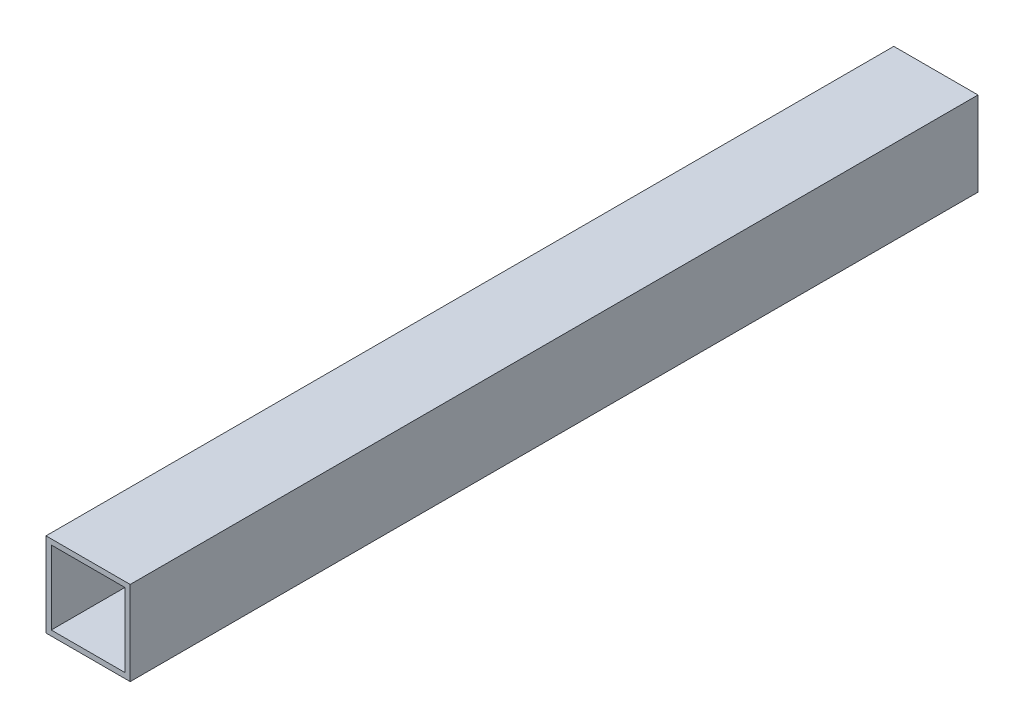
ISO-10303-21;
HEADER;
FILE_DESCRIPTION(('STEP AP214'),'2;1');
FILE_NAME('part.step','',(''),(''),'','','');
FILE_SCHEMA(('AUTOMOTIVE_DESIGN { 1 0 10303 214 1 1 1 1 }'));
ENDSEC;
DATA;
#1=APPLICATION_CONTEXT('core data for automotive mechanical design processes');
#2=APPLICATION_PROTOCOL_DEFINITION('international standard','automotive_design',2000,#1);
#3=PRODUCT_CONTEXT('',#1,'mechanical');
#4=PRODUCT('Part','Part','',(#3));
#5=PRODUCT_RELATED_PRODUCT_CATEGORY('part','',(#4));
#6=PRODUCT_DEFINITION_FORMATION('','',#4);
#7=PRODUCT_DEFINITION_CONTEXT('part definition',#1,'design');
#8=PRODUCT_DEFINITION('design','',#6,#7);
#9=PRODUCT_DEFINITION_SHAPE('','',#8);
#10=(LENGTH_UNIT() NAMED_UNIT(*) SI_UNIT(.MILLI.,.METRE.));
#11=(NAMED_UNIT(*) PLANE_ANGLE_UNIT() SI_UNIT($,.RADIAN.));
#12=(NAMED_UNIT(*) SI_UNIT($,.STERADIAN.) SOLID_ANGLE_UNIT());
#13=UNCERTAINTY_MEASURE_WITH_UNIT(LENGTH_MEASURE(1.E-05),#10,'distance_accuracy_value','');
#14=(GEOMETRIC_REPRESENTATION_CONTEXT(3) GLOBAL_UNCERTAINTY_ASSIGNED_CONTEXT((#13)) GLOBAL_UNIT_ASSIGNED_CONTEXT((#10,
#11,#12)) REPRESENTATION_CONTEXT('',''));
#15=CARTESIAN_POINT('',(0.,0.,0.));
#16=DIRECTION('',(0.,0.,1.));
#17=DIRECTION('',(1.,0.,0.));
#18=AXIS2_PLACEMENT_3D('',#15,#16,#17);
#19=CARTESIAN_POINT('',(-12.7,-28.5749999999999,-54.9710244842767));
#20=DIRECTION('',(0.,-1.,0.));
#21=DIRECTION('',(0.,0.,-1.));
#22=AXIS2_PLACEMENT_3D('',#19,#20,#21);
#23=PLANE('',#22);
#24=DIRECTION('',(-1.,0.,0.));
#25=VECTOR('',#24,1.);
#26=CARTESIAN_POINT('',(-12.7,-28.5749999999999,-19.0500000000001));
#27=LINE('',#26,#25);
#28=CARTESIAN_POINT('',(12.7,-28.5749999999999,-19.0500000000001));
#29=VERTEX_POINT('',#28);
#30=CARTESIAN_POINT('',(-12.7,-28.5749999999999,-19.0500000000001));
#31=VERTEX_POINT('',#30);
#32=EDGE_CURVE('E11',#29,#31,#27,.T.);
#33=ORIENTED_EDGE('',*,*,#32,.F.);
#34=DIRECTION('',(0.,0.,1.));
#35=VECTOR('',#34,1.);
#36=CARTESIAN_POINT('',(12.7,-28.5749999999999,-54.9710244842767));
#37=LINE('',#36,#35);
#38=CARTESIAN_POINT('',(12.7,-28.5749999999999,236.728000000002));
#39=VERTEX_POINT('',#38);
#40=EDGE_CURVE('E107',#29,#39,#37,.T.);
#41=ORIENTED_EDGE('',*,*,#40,.T.);
#42=DIRECTION('',(1.,0.,0.));
#43=VECTOR('',#42,1.);
#44=CARTESIAN_POINT('',(-12.7,-28.5749999999999,236.728000000002));
#45=LINE('',#44,#43);
#46=CARTESIAN_POINT('',(-12.7,-28.5749999999999,236.728000000002));
#47=VERTEX_POINT('',#46);
#48=EDGE_CURVE('E135',#47,#39,#45,.T.);
#49=ORIENTED_EDGE('',*,*,#48,.F.);
#50=DIRECTION('',(0.,0.,1.));
#51=VECTOR('',#50,1.);
#52=CARTESIAN_POINT('',(-12.7,-28.5749999999999,-54.9710244842767));
#53=LINE('',#52,#51);
#54=EDGE_CURVE('E109',#31,#47,#53,.T.);
#55=ORIENTED_EDGE('',*,*,#54,.F.);
#56=EDGE_LOOP('',(#33,#41,#49,#55));
#57=FACE_BOUND('',#56,.T.);
#58=ADVANCED_FACE('F31',(#57),#23,.T.);
#59=CARTESIAN_POINT('',(12.7,-3.17499999999989,-54.9710244842767));
#60=DIRECTION('',(1.,0.,0.));
#61=DIRECTION('',(0.,0.,-1.));
#62=AXIS2_PLACEMENT_3D('',#59,#60,#61);
#63=PLANE('',#62);
#64=DIRECTION('',(0.,-1.,0.));
#65=VECTOR('',#64,1.);
#66=CARTESIAN_POINT('',(12.7,-3.1749999999999,-19.0500000000001));
#67=LINE('',#66,#65);
#68=CARTESIAN_POINT('',(12.7,-3.17499999999989,-19.0500000000001));
#69=VERTEX_POINT('',#68);
#70=EDGE_CURVE('E76',#69,#29,#67,.T.);
#71=ORIENTED_EDGE('',*,*,#70,.F.);
#72=DIRECTION('',(0.,0.,1.));
#73=VECTOR('',#72,1.);
#74=CARTESIAN_POINT('',(12.7,-3.17499999999989,-54.9710244842767));
#75=LINE('',#74,#73);
#76=CARTESIAN_POINT('',(12.7,-3.17499999999989,236.728000000002));
#77=VERTEX_POINT('',#76);
#78=EDGE_CURVE('E104',#69,#77,#75,.T.);
#79=ORIENTED_EDGE('',*,*,#78,.T.);
#80=DIRECTION('',(0.,1.,0.));
#81=VECTOR('',#80,1.);
#82=CARTESIAN_POINT('',(12.7,-3.17499999999992,236.728000000002));
#83=LINE('',#82,#81);
#84=EDGE_CURVE('E138',#39,#77,#83,.T.);
#85=ORIENTED_EDGE('',*,*,#84,.F.);
#86=ORIENTED_EDGE('',*,*,#40,.F.);
#87=EDGE_LOOP('',(#71,#79,#85,#86));
#88=FACE_BOUND('',#87,.T.);
#89=ADVANCED_FACE('F171',(#88),#63,.T.);
#90=CARTESIAN_POINT('',(-12.7,-3.17499999999989,-54.9710244842767));
#91=DIRECTION('',(0.,1.,0.));
#92=DIRECTION('',(0.,0.,1.));
#93=AXIS2_PLACEMENT_3D('',#90,#91,#92);
#94=PLANE('',#93);
#95=DIRECTION('',(1.,0.,0.));
#96=VECTOR('',#95,1.);
#97=CARTESIAN_POINT('',(-12.7,-3.17499999999989,-19.0500000000001));
#98=LINE('',#97,#96);
#99=CARTESIAN_POINT('',(-12.7,-3.17499999999989,-19.0500000000001));
#100=VERTEX_POINT('',#99);
#101=EDGE_CURVE('E50',#100,#69,#98,.T.);
#102=ORIENTED_EDGE('',*,*,#101,.F.);
#103=DIRECTION('',(0.,0.,1.));
#104=VECTOR('',#103,1.);
#105=CARTESIAN_POINT('',(-12.7,-3.17499999999989,-54.9710244842767));
#106=LINE('',#105,#104);
#107=CARTESIAN_POINT('',(-12.7,-3.17499999999989,236.728000000002));
#108=VERTEX_POINT('',#107);
#109=EDGE_CURVE('E77',#100,#108,#106,.T.);
#110=ORIENTED_EDGE('',*,*,#109,.T.);
#111=DIRECTION('',(-1.,0.,0.));
#112=VECTOR('',#111,1.);
#113=CARTESIAN_POINT('',(-12.7,-3.17499999999989,236.728000000002));
#114=LINE('',#113,#112);
#115=EDGE_CURVE('E141',#77,#108,#114,.T.);
#116=ORIENTED_EDGE('',*,*,#115,.F.);
#117=ORIENTED_EDGE('',*,*,#78,.F.);
#118=EDGE_LOOP('',(#102,#110,#116,#117));
#119=FACE_BOUND('',#118,.T.);
#120=ADVANCED_FACE('F176',(#119),#94,.T.);
#121=CARTESIAN_POINT('',(-12.7,-3.17499999999989,-54.9710244842767));
#122=DIRECTION('',(-1.,0.,0.));
#123=DIRECTION('',(0.,0.,1.));
#124=AXIS2_PLACEMENT_3D('',#121,#122,#123);
#125=PLANE('',#124);
#126=DIRECTION('',(0.,1.,0.));
#127=VECTOR('',#126,1.);
#128=CARTESIAN_POINT('',(-12.7,-3.1749999999999,-19.0500000000001));
#129=LINE('',#128,#127);
#130=EDGE_CURVE('E124',#31,#100,#129,.T.);
#131=ORIENTED_EDGE('',*,*,#130,.F.);
#132=ORIENTED_EDGE('',*,*,#54,.T.);
#133=DIRECTION('',(0.,-1.,0.));
#134=VECTOR('',#133,1.);
#135=CARTESIAN_POINT('',(-12.7,-3.17499999999992,236.728000000002));
#136=LINE('',#135,#134);
#137=EDGE_CURVE('E132',#108,#47,#136,.T.);
#138=ORIENTED_EDGE('',*,*,#137,.F.);
#139=ORIENTED_EDGE('',*,*,#109,.F.);
#140=EDGE_LOOP('',(#131,#132,#138,#139));
#141=FACE_BOUND('',#140,.T.);
#142=ADVANCED_FACE('F33',(#141),#125,.T.);
#143=CARTESIAN_POINT('',(-11.1125,-26.9874999999999,-54.9710244842767));
#144=DIRECTION('',(0.,-1.,0.));
#145=DIRECTION('',(0.,0.,-1.));
#146=AXIS2_PLACEMENT_3D('',#143,#144,#145);
#147=PLANE('',#146);
#148=DIRECTION('',(0.,0.,1.));
#149=VECTOR('',#148,1.);
#150=CARTESIAN_POINT('',(11.1125,-26.9874999999999,-54.9710244842767));
#151=LINE('',#150,#149);
#152=CARTESIAN_POINT('',(11.1125,-26.9874999999999,-19.0500000000001));
#153=VERTEX_POINT('',#152);
#154=CARTESIAN_POINT('',(11.1125,-26.9874999999999,236.728000000002));
#155=VERTEX_POINT('',#154);
#156=EDGE_CURVE('E83',#153,#155,#151,.T.);
#157=ORIENTED_EDGE('',*,*,#156,.F.);
#158=DIRECTION('',(-1.,0.,0.));
#159=VECTOR('',#158,1.);
#160=CARTESIAN_POINT('',(-11.1125,-26.9874999999999,-19.0500000000001));
#161=LINE('',#160,#159);
#162=CARTESIAN_POINT('',(-11.1125,-26.9874999999999,-19.0500000000001));
#163=VERTEX_POINT('',#162);
#164=EDGE_CURVE('E35',#153,#163,#161,.T.);
#165=ORIENTED_EDGE('',*,*,#164,.T.);
#166=DIRECTION('',(0.,0.,1.));
#167=VECTOR('',#166,1.);
#168=CARTESIAN_POINT('',(-11.1125,-26.9874999999999,-54.9710244842767));
#169=LINE('',#168,#167);
#170=CARTESIAN_POINT('',(-11.1125,-26.9874999999999,236.728000000002));
#171=VERTEX_POINT('',#170);
#172=EDGE_CURVE('E94',#163,#171,#169,.T.);
#173=ORIENTED_EDGE('',*,*,#172,.T.);
#174=DIRECTION('',(1.,0.,0.));
#175=VECTOR('',#174,1.);
#176=CARTESIAN_POINT('',(-11.1125,-26.9874999999999,236.728000000002));
#177=LINE('',#176,#175);
#178=EDGE_CURVE('E93',#171,#155,#177,.T.);
#179=ORIENTED_EDGE('',*,*,#178,.T.);
#180=EDGE_LOOP('',(#157,#165,#173,#179));
#181=FACE_BOUND('',#180,.T.);
#182=ADVANCED_FACE('F91',(#181),#147,.F.);
#183=CARTESIAN_POINT('',(11.1125,-4.76249999999989,-54.9710244842767));
#184=DIRECTION('',(1.,0.,0.));
#185=DIRECTION('',(0.,0.,-1.));
#186=AXIS2_PLACEMENT_3D('',#183,#184,#185);
#187=PLANE('',#186);
#188=DIRECTION('',(0.,0.,1.));
#189=VECTOR('',#188,1.);
#190=CARTESIAN_POINT('',(11.1125,-4.76249999999989,-54.9710244842767));
#191=LINE('',#190,#189);
#192=CARTESIAN_POINT('',(11.1125,-4.76249999999989,-19.0500000000001));
#193=VERTEX_POINT('',#192);
#194=CARTESIAN_POINT('',(11.1125,-4.76249999999989,236.728000000002));
#195=VERTEX_POINT('',#194);
#196=EDGE_CURVE('E86',#193,#195,#191,.T.);
#197=ORIENTED_EDGE('',*,*,#196,.F.);
#198=DIRECTION('',(0.,-1.,0.));
#199=VECTOR('',#198,1.);
#200=CARTESIAN_POINT('',(11.1125,-4.76249999999989,-19.0500000000001));
#201=LINE('',#200,#199);
#202=EDGE_CURVE('E41',#193,#153,#201,.T.);
#203=ORIENTED_EDGE('',*,*,#202,.T.);
#204=ORIENTED_EDGE('',*,*,#156,.T.);
#205=DIRECTION('',(0.,1.,0.));
#206=VECTOR('',#205,1.);
#207=CARTESIAN_POINT('',(11.1125,-4.76249999999992,236.728000000002));
#208=LINE('',#207,#206);
#209=EDGE_CURVE('E147',#155,#195,#208,.T.);
#210=ORIENTED_EDGE('',*,*,#209,.T.);
#211=EDGE_LOOP('',(#197,#203,#204,#210));
#212=FACE_BOUND('',#211,.T.);
#213=ADVANCED_FACE('F80',(#212),#187,.F.);
#214=CARTESIAN_POINT('',(-11.1125,-4.76249999999989,-54.9710244842767));
#215=DIRECTION('',(0.,1.,0.));
#216=DIRECTION('',(0.,0.,1.));
#217=AXIS2_PLACEMENT_3D('',#214,#215,#216);
#218=PLANE('',#217);
#219=DIRECTION('',(0.,0.,1.));
#220=VECTOR('',#219,1.);
#221=CARTESIAN_POINT('',(-11.1125,-4.76249999999989,-54.9710244842767));
#222=LINE('',#221,#220);
#223=CARTESIAN_POINT('',(-11.1125,-4.76249999999989,-19.0500000000001));
#224=VERTEX_POINT('',#223);
#225=CARTESIAN_POINT('',(-11.1125,-4.76249999999989,236.728000000002));
#226=VERTEX_POINT('',#225);
#227=EDGE_CURVE('E96',#224,#226,#222,.T.);
#228=ORIENTED_EDGE('',*,*,#227,.F.);
#229=DIRECTION('',(1.,0.,0.));
#230=VECTOR('',#229,1.);
#231=CARTESIAN_POINT('',(-11.1125,-4.76249999999989,-19.0500000000001));
#232=LINE('',#231,#230);
#233=EDGE_CURVE('E88',#224,#193,#232,.T.);
#234=ORIENTED_EDGE('',*,*,#233,.T.);
#235=ORIENTED_EDGE('',*,*,#196,.T.);
#236=DIRECTION('',(-1.,0.,0.));
#237=VECTOR('',#236,1.);
#238=CARTESIAN_POINT('',(-11.1125,-4.76249999999989,236.728000000002));
#239=LINE('',#238,#237);
#240=EDGE_CURVE('E98',#195,#226,#239,.T.);
#241=ORIENTED_EDGE('',*,*,#240,.T.);
#242=EDGE_LOOP('',(#228,#234,#235,#241));
#243=FACE_BOUND('',#242,.T.);
#244=ADVANCED_FACE('F219',(#243),#218,.F.);
#245=CARTESIAN_POINT('',(-11.1125,-4.76249999999989,-54.9710244842767));
#246=DIRECTION('',(-1.,0.,0.));
#247=DIRECTION('',(0.,0.,1.));
#248=AXIS2_PLACEMENT_3D('',#245,#246,#247);
#249=PLANE('',#248);
#250=ORIENTED_EDGE('',*,*,#172,.F.);
#251=DIRECTION('',(0.,1.,0.));
#252=VECTOR('',#251,1.);
#253=CARTESIAN_POINT('',(-11.1125,-4.76249999999989,-19.0500000000001));
#254=LINE('',#253,#252);
#255=EDGE_CURVE('E71',#163,#224,#254,.T.);
#256=ORIENTED_EDGE('',*,*,#255,.T.);
#257=ORIENTED_EDGE('',*,*,#227,.T.);
#258=DIRECTION('',(0.,-1.,0.));
#259=VECTOR('',#258,1.);
#260=CARTESIAN_POINT('',(-11.1125,-4.76249999999992,236.728000000002));
#261=LINE('',#260,#259);
#262=EDGE_CURVE('E144',#226,#171,#261,.T.);
#263=ORIENTED_EDGE('',*,*,#262,.T.);
#264=EDGE_LOOP('',(#250,#256,#257,#263));
#265=FACE_BOUND('',#264,.T.);
#266=ADVANCED_FACE('F228',(#265),#249,.F.);
#267=CARTESIAN_POINT('',(0.,30.1625,-19.0500000000001));
#268=DIRECTION('',(0.,0.,1.));
#269=DIRECTION('',(1.,0.,0.));
#270=AXIS2_PLACEMENT_3D('',#267,#268,#269);
#271=PLANE('',#270);
#272=ORIENTED_EDGE('',*,*,#130,.T.);
#273=ORIENTED_EDGE('',*,*,#101,.T.);
#274=ORIENTED_EDGE('',*,*,#70,.T.);
#275=ORIENTED_EDGE('',*,*,#32,.T.);
#276=EDGE_LOOP('',(#272,#273,#274,#275));
#277=FACE_BOUND('',#276,.T.);
#278=ORIENTED_EDGE('',*,*,#164,.F.);
#279=ORIENTED_EDGE('',*,*,#202,.F.);
#280=ORIENTED_EDGE('',*,*,#233,.F.);
#281=ORIENTED_EDGE('',*,*,#255,.F.);
#282=EDGE_LOOP('',(#278,#279,#280,#281));
#283=FACE_BOUND('',#282,.T.);
#284=ADVANCED_FACE('F68',(#277,#283),#271,.F.);
#285=CARTESIAN_POINT('',(0.,30.1624999999999,236.728000000002));
#286=DIRECTION('',(0.,0.,1.));
#287=DIRECTION('',(1.,0.,0.));
#288=AXIS2_PLACEMENT_3D('',#285,#286,#287);
#289=PLANE('',#288);
#290=ORIENTED_EDGE('',*,*,#262,.F.);
#291=ORIENTED_EDGE('',*,*,#240,.F.);
#292=ORIENTED_EDGE('',*,*,#209,.F.);
#293=ORIENTED_EDGE('',*,*,#178,.F.);
#294=EDGE_LOOP('',(#290,#291,#292,#293));
#295=FACE_BOUND('',#294,.T.);
#296=ORIENTED_EDGE('',*,*,#115,.T.);
#297=ORIENTED_EDGE('',*,*,#137,.T.);
#298=ORIENTED_EDGE('',*,*,#48,.T.);
#299=ORIENTED_EDGE('',*,*,#84,.T.);
#300=EDGE_LOOP('',(#296,#297,#298,#299));
#301=FACE_BOUND('',#300,.T.);
#302=ADVANCED_FACE('F152',(#295,#301),#289,.T.);
#303=CLOSED_SHELL('',(#58,#89,#120,#142,#182,#213,#244,#266,#284,#302));
#304=MANIFOLD_SOLID_BREP('B2',#303);
#305=ADVANCED_BREP_SHAPE_REPRESENTATION('',(#18,#304),#14);
#306=SHAPE_DEFINITION_REPRESENTATION(#9,#305);
ENDSEC;
END-ISO-10303-21;
